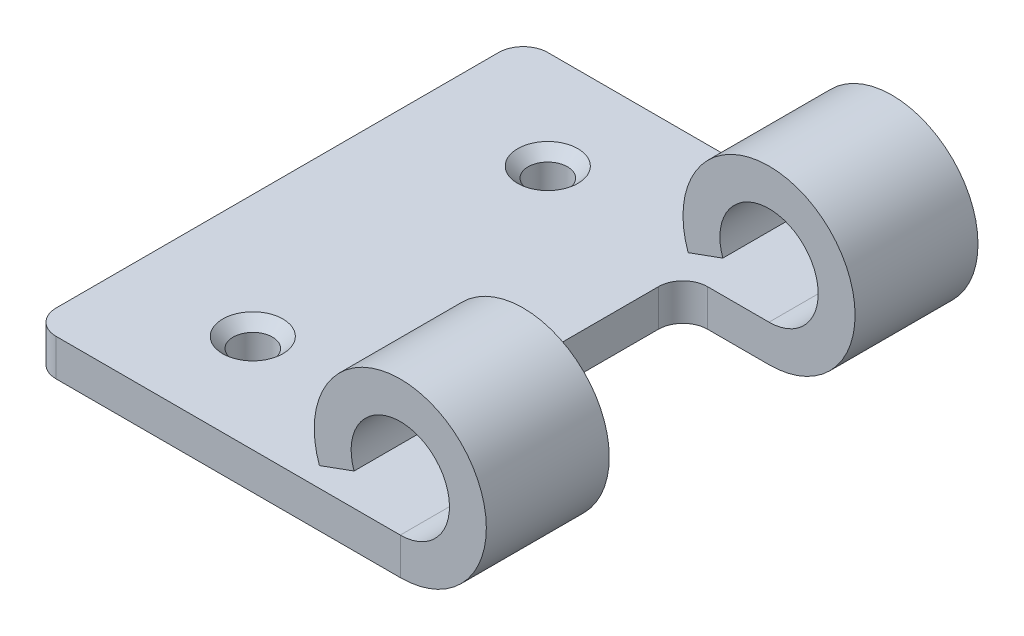
ISO-10303-21;
HEADER;
FILE_DESCRIPTION(('STEP AP214'),'2;1');
FILE_NAME('part.step','',(''),(''),'','','');
FILE_SCHEMA(('AUTOMOTIVE_DESIGN { 1 0 10303 214 1 1 1 1 }'));
ENDSEC;
DATA;
#1=APPLICATION_CONTEXT('core data for automotive mechanical design processes');
#2=APPLICATION_PROTOCOL_DEFINITION('international standard','automotive_design',2000,#1);
#3=PRODUCT_CONTEXT('',#1,'mechanical');
#4=PRODUCT('Part','Part','',(#3));
#5=PRODUCT_RELATED_PRODUCT_CATEGORY('part','',(#4));
#6=PRODUCT_DEFINITION_FORMATION('','',#4);
#7=PRODUCT_DEFINITION_CONTEXT('part definition',#1,'design');
#8=PRODUCT_DEFINITION('design','',#6,#7);
#9=PRODUCT_DEFINITION_SHAPE('','',#8);
#10=(LENGTH_UNIT() NAMED_UNIT(*) SI_UNIT(.MILLI.,.METRE.));
#11=(NAMED_UNIT(*) PLANE_ANGLE_UNIT() SI_UNIT($,.RADIAN.));
#12=(NAMED_UNIT(*) SI_UNIT($,.STERADIAN.) SOLID_ANGLE_UNIT());
#13=UNCERTAINTY_MEASURE_WITH_UNIT(LENGTH_MEASURE(1.E-05),#10,'distance_accuracy_value','');
#14=(GEOMETRIC_REPRESENTATION_CONTEXT(3) GLOBAL_UNCERTAINTY_ASSIGNED_CONTEXT((#13)) GLOBAL_UNIT_ASSIGNED_CONTEXT((#10,
#11,#12)) REPRESENTATION_CONTEXT('',''));
#15=CARTESIAN_POINT('',(0.,0.,0.));
#16=DIRECTION('',(0.,0.,1.));
#17=DIRECTION('',(1.,0.,0.));
#18=AXIS2_PLACEMENT_3D('',#15,#16,#17);
#19=CARTESIAN_POINT('',(18.5,-1.5,5.));
#20=DIRECTION('',(0.,0.,1.));
#21=DIRECTION('',(1.,0.,0.));
#22=AXIS2_PLACEMENT_3D('',#19,#20,#21);
#23=PLANE('',#22);
#24=DIRECTION('',(1.,0.,0.));
#25=VECTOR('',#24,1.);
#26=CARTESIAN_POINT('',(18.5,-1.5,5.));
#27=LINE('',#26,#25);
#28=CARTESIAN_POINT('',(12.5,-1.5,5.));
#29=VERTEX_POINT('',#28);
#30=CARTESIAN_POINT('',(15.,-1.5,5.));
#31=VERTEX_POINT('',#30);
#32=EDGE_CURVE('E325',#29,#31,#27,.T.);
#33=ORIENTED_EDGE('',*,*,#32,.F.);
#34=DIRECTION('',(0.,1.,0.));
#35=VECTOR('',#34,1.);
#36=CARTESIAN_POINT('',(12.5,0.,5.));
#37=LINE('',#36,#35);
#38=CARTESIAN_POINT('',(12.5,0.,5.));
#39=VERTEX_POINT('',#38);
#40=EDGE_CURVE('E275',#29,#39,#37,.T.);
#41=ORIENTED_EDGE('',*,*,#40,.T.);
#42=DIRECTION('',(1.,0.,0.));
#43=VECTOR('',#42,1.);
#44=CARTESIAN_POINT('',(0.,0.,5.));
#45=LINE('',#44,#43);
#46=CARTESIAN_POINT('',(15.,0.,5.));
#47=VERTEX_POINT('',#46);
#48=EDGE_CURVE('E352',#39,#47,#45,.T.);
#49=ORIENTED_EDGE('',*,*,#48,.T.);
#50=DIRECTION('',(0.,-1.,0.));
#51=VECTOR('',#50,1.);
#52=CARTESIAN_POINT('',(15.,0.,5.));
#53=LINE('',#52,#51);
#54=EDGE_CURVE('E216',#47,#31,#53,.T.);
#55=ORIENTED_EDGE('',*,*,#54,.T.);
#56=EDGE_LOOP('',(#33,#41,#49,#55));
#57=FACE_BOUND('',#56,.T.);
#58=ADVANCED_FACE('F54',(#57),#23,.F.);
#59=CARTESIAN_POINT('',(15.,2.,10.));
#60=DIRECTION('',(0.,0.,-1.));
#61=DIRECTION('',(-1.,0.,0.));
#62=AXIS2_PLACEMENT_3D('',#59,#60,#61);
#63=CYLINDRICAL_SURFACE('',#62,3.5);
#64=DIRECTION('',(0.,0.,-1.));
#65=VECTOR('',#64,1.);
#66=CARTESIAN_POINT('',(15.,-1.5,10.));
#67=LINE('',#66,#65);
#68=CARTESIAN_POINT('',(15.,-1.5,10.));
#69=VERTEX_POINT('',#68);
#70=EDGE_CURVE('E235',#69,#31,#67,.T.);
#71=ORIENTED_EDGE('',*,*,#70,.T.);
#72=CARTESIAN_POINT('',(15.,2.,5.));
#73=DIRECTION('',(0.,0.,1.));
#74=DIRECTION('',(1.,0.,0.));
#75=AXIS2_PLACEMENT_3D('',#72,#73,#74);
#76=CIRCLE('',#75,3.5);
#77=CARTESIAN_POINT('',(11.7110758272493,0.802929498360173,5.));
#78=VERTEX_POINT('',#77);
#79=EDGE_CURVE('E360',#31,#78,#76,.T.);
#80=ORIENTED_EDGE('',*,*,#79,.T.);
#81=DIRECTION('',(0.,0.,-1.));
#82=VECTOR('',#81,1.);
#83=CARTESIAN_POINT('',(11.7110758272493,0.802929498360173,10.));
#84=LINE('',#83,#82);
#85=CARTESIAN_POINT('',(11.7110758272493,0.802929498360173,10.));
#86=VERTEX_POINT('',#85);
#87=EDGE_CURVE('E265',#86,#78,#84,.T.);
#88=ORIENTED_EDGE('',*,*,#87,.F.);
#89=CARTESIAN_POINT('',(15.,2.,10.));
#90=DIRECTION('',(0.,0.,1.));
#91=DIRECTION('',(1.,0.,0.));
#92=AXIS2_PLACEMENT_3D('',#89,#90,#91);
#93=CIRCLE('',#92,3.5);
#94=EDGE_CURVE('E365',#69,#86,#93,.T.);
#95=ORIENTED_EDGE('',*,*,#94,.F.);
#96=EDGE_LOOP('',(#71,#80,#88,#95));
#97=FACE_BOUND('',#96,.T.);
#98=ADVANCED_FACE('F541',(#97),#63,.T.);
#99=CARTESIAN_POINT('',(13.1206147584282,1.31595971334867,10.));
#100=DIRECTION('',(0.342020143325665,-0.93969262078591,0.));
#101=DIRECTION('',(0.93969262078591,0.342020143325665,0.));
#102=AXIS2_PLACEMENT_3D('',#99,#100,#101);
#103=PLANE('',#102);
#104=DIRECTION('',(-0.93969262078591,-0.342020143325665,0.));
#105=VECTOR('',#104,1.);
#106=CARTESIAN_POINT('',(13.1206147584282,1.31595971334867,5.));
#107=LINE('',#106,#105);
#108=CARTESIAN_POINT('',(13.1206147584282,1.31595971334867,5.));
#109=VERTEX_POINT('',#108);
#110=EDGE_CURVE('E358',#109,#78,#107,.T.);
#111=ORIENTED_EDGE('',*,*,#110,.F.);
#112=DIRECTION('',(0.,0.,-1.));
#113=VECTOR('',#112,1.);
#114=CARTESIAN_POINT('',(13.1206147584282,1.31595971334867,10.));
#115=LINE('',#114,#113);
#116=CARTESIAN_POINT('',(13.1206147584282,1.31595971334867,10.));
#117=VERTEX_POINT('',#116);
#118=EDGE_CURVE('E261',#117,#109,#115,.T.);
#119=ORIENTED_EDGE('',*,*,#118,.F.);
#120=DIRECTION('',(-0.93969262078591,-0.342020143325665,0.));
#121=VECTOR('',#120,1.);
#122=CARTESIAN_POINT('',(13.1206147584282,1.31595971334867,10.));
#123=LINE('',#122,#121);
#124=EDGE_CURVE('E368',#117,#86,#123,.T.);
#125=ORIENTED_EDGE('',*,*,#124,.T.);
#126=ORIENTED_EDGE('',*,*,#87,.T.);
#127=EDGE_LOOP('',(#111,#119,#125,#126));
#128=FACE_BOUND('',#127,.T.);
#129=ADVANCED_FACE('F532',(#128),#103,.T.);
#130=CARTESIAN_POINT('',(15.,2.,10.));
#131=DIRECTION('',(0.,0.,-1.));
#132=DIRECTION('',(-1.,0.,0.));
#133=AXIS2_PLACEMENT_3D('',#130,#131,#132);
#134=CYLINDRICAL_SURFACE('',#133,2.);
#135=CARTESIAN_POINT('',(15.,2.,5.));
#136=DIRECTION('',(0.,0.,1.));
#137=DIRECTION('',(1.,0.,0.));
#138=AXIS2_PLACEMENT_3D('',#135,#136,#137);
#139=CIRCLE('',#138,2.);
#140=EDGE_CURVE('E355',#47,#109,#139,.T.);
#141=ORIENTED_EDGE('',*,*,#140,.F.);
#142=DIRECTION('',(0.,0.,-1.));
#143=VECTOR('',#142,1.);
#144=CARTESIAN_POINT('',(15.,0.,10.));
#145=LINE('',#144,#143);
#146=CARTESIAN_POINT('',(15.,0.,10.));
#147=VERTEX_POINT('',#146);
#148=EDGE_CURVE('E256',#147,#47,#145,.T.);
#149=ORIENTED_EDGE('',*,*,#148,.F.);
#150=CARTESIAN_POINT('',(15.,2.,10.));
#151=DIRECTION('',(0.,0.,1.));
#152=DIRECTION('',(1.,0.,0.));
#153=AXIS2_PLACEMENT_3D('',#150,#151,#152);
#154=CIRCLE('',#153,2.);
#155=EDGE_CURVE('E371',#147,#117,#154,.T.);
#156=ORIENTED_EDGE('',*,*,#155,.T.);
#157=ORIENTED_EDGE('',*,*,#118,.T.);
#158=EDGE_LOOP('',(#141,#149,#156,#157));
#159=FACE_BOUND('',#158,.T.);
#160=ADVANCED_FACE('F538',(#159),#134,.F.);
#161=CARTESIAN_POINT('',(15.,-1.5,10.));
#162=DIRECTION('',(0.,0.,1.));
#163=DIRECTION('',(1.,0.,0.));
#164=AXIS2_PLACEMENT_3D('',#161,#162,#163);
#165=PLANE('',#164);
#166=DIRECTION('',(0.,1.,0.));
#167=VECTOR('',#166,1.);
#168=CARTESIAN_POINT('',(15.,-1.5,10.));
#169=LINE('',#168,#167);
#170=EDGE_CURVE('E217',#69,#147,#169,.T.);
#171=ORIENTED_EDGE('',*,*,#170,.F.);
#172=ORIENTED_EDGE('',*,*,#94,.T.);
#173=ORIENTED_EDGE('',*,*,#124,.F.);
#174=ORIENTED_EDGE('',*,*,#155,.F.);
#175=EDGE_LOOP('',(#171,#172,#173,#174));
#176=FACE_BOUND('',#175,.T.);
#177=ADVANCED_FACE('F578',(#176),#165,.T.);
#178=CARTESIAN_POINT('',(15.,0.,-10.));
#179=DIRECTION('',(0.,0.,-1.));
#180=DIRECTION('',(-1.,0.,0.));
#181=AXIS2_PLACEMENT_3D('',#178,#179,#180);
#182=PLANE('',#181);
#183=DIRECTION('',(0.,-1.,0.));
#184=VECTOR('',#183,1.);
#185=CARTESIAN_POINT('',(15.,0.,-10.));
#186=LINE('',#185,#184);
#187=CARTESIAN_POINT('',(15.,0.,-10.));
#188=VERTEX_POINT('',#187);
#189=CARTESIAN_POINT('',(15.,-1.5,-10.));
#190=VERTEX_POINT('',#189);
#191=EDGE_CURVE('E269',#188,#190,#186,.T.);
#192=ORIENTED_EDGE('',*,*,#191,.F.);
#193=CARTESIAN_POINT('',(15.,2.,-10.));
#194=DIRECTION('',(0.,0.,1.));
#195=DIRECTION('',(1.,0.,0.));
#196=AXIS2_PLACEMENT_3D('',#193,#194,#195);
#197=CIRCLE('',#196,2.);
#198=CARTESIAN_POINT('',(13.1206147584282,1.31595971334867,-10.));
#199=VERTEX_POINT('',#198);
#200=EDGE_CURVE('E382',#188,#199,#197,.T.);
#201=ORIENTED_EDGE('',*,*,#200,.T.);
#202=DIRECTION('',(-0.93969262078591,-0.342020143325665,0.));
#203=VECTOR('',#202,1.);
#204=CARTESIAN_POINT('',(13.1206147584282,1.31595971334867,-10.));
#205=LINE('',#204,#203);
#206=CARTESIAN_POINT('',(11.7110758272493,0.802929498360173,-10.));
#207=VERTEX_POINT('',#206);
#208=EDGE_CURVE('E379',#199,#207,#205,.T.);
#209=ORIENTED_EDGE('',*,*,#208,.T.);
#210=CARTESIAN_POINT('',(15.,2.,-10.));
#211=DIRECTION('',(0.,0.,1.));
#212=DIRECTION('',(1.,0.,0.));
#213=AXIS2_PLACEMENT_3D('',#210,#211,#212);
#214=CIRCLE('',#213,3.5);
#215=EDGE_CURVE('E364',#190,#207,#214,.T.);
#216=ORIENTED_EDGE('',*,*,#215,.F.);
#217=EDGE_LOOP('',(#192,#201,#209,#216));
#218=FACE_BOUND('',#217,.T.);
#219=ADVANCED_FACE('F524',(#218),#182,.T.);
#220=CARTESIAN_POINT('',(11.7110758272493,0.802929498360173,-5.));
#221=VERTEX_POINT('',#220);
#222=EDGE_CURVE('E226',#221,#207,#84,.T.);
#223=ORIENTED_EDGE('',*,*,#222,.F.);
#224=CARTESIAN_POINT('',(15.,2.,-5.));
#225=DIRECTION('',(0.,0.,-1.));
#226=DIRECTION('',(-1.,0.,0.));
#227=AXIS2_PLACEMENT_3D('',#224,#225,#226);
#228=CIRCLE('',#227,3.5);
#229=CARTESIAN_POINT('',(15.,-1.5,-5.));
#230=VERTEX_POINT('',#229);
#231=EDGE_CURVE('E208',#221,#230,#228,.T.);
#232=ORIENTED_EDGE('',*,*,#231,.T.);
#233=EDGE_CURVE('E224',#230,#190,#67,.T.);
#234=ORIENTED_EDGE('',*,*,#233,.T.);
#235=ORIENTED_EDGE('',*,*,#215,.T.);
#236=EDGE_LOOP('',(#223,#232,#234,#235));
#237=FACE_BOUND('',#236,.T.);
#238=ADVANCED_FACE('F222',(#237),#63,.T.);
#239=DIRECTION('',(0.93969262078591,0.342020143325665,0.));
#240=VECTOR('',#239,1.);
#241=CARTESIAN_POINT('',(13.1206147584282,1.31595971334867,-5.));
#242=LINE('',#241,#240);
#243=CARTESIAN_POINT('',(13.1206147584282,1.31595971334867,-5.));
#244=VERTEX_POINT('',#243);
#245=EDGE_CURVE('E229',#221,#244,#242,.T.);
#246=ORIENTED_EDGE('',*,*,#245,.F.);
#247=ORIENTED_EDGE('',*,*,#222,.T.);
#248=ORIENTED_EDGE('',*,*,#208,.F.);
#249=EDGE_CURVE('E260',#244,#199,#115,.T.);
#250=ORIENTED_EDGE('',*,*,#249,.F.);
#251=EDGE_LOOP('',(#246,#247,#248,#250));
#252=FACE_BOUND('',#251,.T.);
#253=ADVANCED_FACE('F529',(#252),#103,.T.);
#254=CARTESIAN_POINT('',(15.,2.,-5.));
#255=DIRECTION('',(0.,0.,-1.));
#256=DIRECTION('',(-1.,0.,0.));
#257=AXIS2_PLACEMENT_3D('',#254,#255,#256);
#258=CIRCLE('',#257,2.);
#259=CARTESIAN_POINT('',(15.,0.,-5.));
#260=VERTEX_POINT('',#259);
#261=EDGE_CURVE('E323',#244,#260,#258,.T.);
#262=ORIENTED_EDGE('',*,*,#261,.F.);
#263=ORIENTED_EDGE('',*,*,#249,.T.);
#264=ORIENTED_EDGE('',*,*,#200,.F.);
#265=EDGE_CURVE('E255',#260,#188,#145,.T.);
#266=ORIENTED_EDGE('',*,*,#265,.F.);
#267=EDGE_LOOP('',(#262,#263,#264,#266));
#268=FACE_BOUND('',#267,.T.);
#269=ADVANCED_FACE('F525',(#268),#134,.F.);
#270=CARTESIAN_POINT('',(0.,0.,10.));
#271=DIRECTION('',(0.,1.,0.));
#272=DIRECTION('',(0.,0.,1.));
#273=AXIS2_PLACEMENT_3D('',#270,#271,#272);
#274=PLANE('',#273);
#275=CARTESIAN_POINT('',(5.,0.,-6.));
#276=DIRECTION('',(0.,1.,0.));
#277=DIRECTION('',(0.,0.,1.));
#278=AXIS2_PLACEMENT_3D('',#275,#276,#277);
#279=CIRCLE('',#278,1.225);
#280=CARTESIAN_POINT('',(5.,0.,-4.775));
#281=VERTEX_POINT('',#280);
#282=EDGE_CURVE('E489',#281,#281,#279,.T.);
#283=ORIENTED_EDGE('',*,*,#282,.F.);
#284=EDGE_LOOP('',(#283));
#285=FACE_BOUND('',#284,.T.);
#286=CARTESIAN_POINT('',(5.,0.,6.));
#287=DIRECTION('',(0.,1.,0.));
#288=DIRECTION('',(0.,0.,1.));
#289=AXIS2_PLACEMENT_3D('',#286,#287,#288);
#290=CIRCLE('',#289,1.225);
#291=CARTESIAN_POINT('',(5.,0.,7.225));
#292=VERTEX_POINT('',#291);
#293=EDGE_CURVE('E483',#292,#292,#290,.T.);
#294=ORIENTED_EDGE('',*,*,#293,.F.);
#295=EDGE_LOOP('',(#294));
#296=FACE_BOUND('',#295,.T.);
#297=DIRECTION('',(1.,0.,0.));
#298=VECTOR('',#297,1.);
#299=CARTESIAN_POINT('',(0.,0.,-10.));
#300=LINE('',#299,#298);
#301=CARTESIAN_POINT('',(1.,0.,-10.));
#302=VERTEX_POINT('',#301);
#303=EDGE_CURVE('E385',#302,#188,#300,.T.);
#304=ORIENTED_EDGE('',*,*,#303,.F.);
#305=CARTESIAN_POINT('',(1.,0.,-9.));
#306=DIRECTION('',(0.,1.,0.));
#307=DIRECTION('',(0.,0.,1.));
#308=AXIS2_PLACEMENT_3D('',#305,#306,#307);
#309=CIRCLE('',#308,1.);
#310=CARTESIAN_POINT('',(0.,0.,-9.));
#311=VERTEX_POINT('',#310);
#312=EDGE_CURVE('E290',#302,#311,#309,.T.);
#313=ORIENTED_EDGE('',*,*,#312,.T.);
#314=DIRECTION('',(0.,0.,-1.));
#315=VECTOR('',#314,1.);
#316=CARTESIAN_POINT('',(0.,0.,10.));
#317=LINE('',#316,#315);
#318=CARTESIAN_POINT('',(0.,0.,9.));
#319=VERTEX_POINT('',#318);
#320=EDGE_CURVE('E252',#319,#311,#317,.T.);
#321=ORIENTED_EDGE('',*,*,#320,.F.);
#322=CARTESIAN_POINT('',(1.,0.,9.));
#323=DIRECTION('',(0.,1.,0.));
#324=DIRECTION('',(0.,0.,1.));
#325=AXIS2_PLACEMENT_3D('',#322,#323,#324);
#326=CIRCLE('',#325,1.);
#327=CARTESIAN_POINT('',(1.,0.,10.));
#328=VERTEX_POINT('',#327);
#329=EDGE_CURVE('E287',#319,#328,#326,.T.);
#330=ORIENTED_EDGE('',*,*,#329,.T.);
#331=DIRECTION('',(1.,0.,0.));
#332=VECTOR('',#331,1.);
#333=CARTESIAN_POINT('',(0.,0.,10.));
#334=LINE('',#333,#332);
#335=EDGE_CURVE('E245',#328,#147,#334,.T.);
#336=ORIENTED_EDGE('',*,*,#335,.T.);
#337=ORIENTED_EDGE('',*,*,#148,.T.);
#338=ORIENTED_EDGE('',*,*,#48,.F.);
#339=CARTESIAN_POINT('',(12.5,0.,4.));
#340=DIRECTION('',(0.,1.,0.));
#341=DIRECTION('',(0.,0.,1.));
#342=AXIS2_PLACEMENT_3D('',#339,#340,#341);
#343=CIRCLE('',#342,1.);
#344=CARTESIAN_POINT('',(11.5,0.,4.));
#345=VERTEX_POINT('',#344);
#346=EDGE_CURVE('E304',#39,#345,#343,.F.);
#347=ORIENTED_EDGE('',*,*,#346,.T.);
#348=DIRECTION('',(0.,0.,1.));
#349=VECTOR('',#348,1.);
#350=CARTESIAN_POINT('',(11.5,0.,10.));
#351=LINE('',#350,#349);
#352=CARTESIAN_POINT('',(11.5,0.,-4.));
#353=VERTEX_POINT('',#352);
#354=EDGE_CURVE('E228',#353,#345,#351,.T.);
#355=ORIENTED_EDGE('',*,*,#354,.F.);
#356=CARTESIAN_POINT('',(12.5,0.,-4.));
#357=DIRECTION('',(0.,1.,0.));
#358=DIRECTION('',(0.,0.,1.));
#359=AXIS2_PLACEMENT_3D('',#356,#357,#358);
#360=CIRCLE('',#359,1.);
#361=CARTESIAN_POINT('',(12.5,0.,-5.));
#362=VERTEX_POINT('',#361);
#363=EDGE_CURVE('E63',#353,#362,#360,.F.);
#364=ORIENTED_EDGE('',*,*,#363,.T.);
#365=DIRECTION('',(-1.,0.,0.));
#366=VECTOR('',#365,1.);
#367=CARTESIAN_POINT('',(0.,0.,-5.));
#368=LINE('',#367,#366);
#369=EDGE_CURVE('E317',#260,#362,#368,.T.);
#370=ORIENTED_EDGE('',*,*,#369,.F.);
#371=ORIENTED_EDGE('',*,*,#265,.T.);
#372=EDGE_LOOP('',(#304,#313,#321,#330,#336,#337,#338,#347,#355,#364,#370,#371));
#373=FACE_BOUND('',#372,.T.);
#374=ADVANCED_FACE('F315',(#285,#296,#373),#274,.T.);
#375=CARTESIAN_POINT('',(0.,-1.5,10.));
#376=DIRECTION('',(-1.,0.,0.));
#377=DIRECTION('',(0.,0.,1.));
#378=AXIS2_PLACEMENT_3D('',#375,#376,#377);
#379=PLANE('',#378);
#380=ORIENTED_EDGE('',*,*,#320,.T.);
#381=DIRECTION('',(0.,1.,0.));
#382=VECTOR('',#381,1.);
#383=CARTESIAN_POINT('',(0.,-1.5,-9.));
#384=LINE('',#383,#382);
#385=CARTESIAN_POINT('',(0.,-1.5,-9.));
#386=VERTEX_POINT('',#385);
#387=EDGE_CURVE('E84',#311,#386,#384,.F.);
#388=ORIENTED_EDGE('',*,*,#387,.T.);
#389=DIRECTION('',(0.,0.,-1.));
#390=VECTOR('',#389,1.);
#391=CARTESIAN_POINT('',(0.,-1.5,10.));
#392=LINE('',#391,#390);
#393=CARTESIAN_POINT('',(0.,-1.5,9.));
#394=VERTEX_POINT('',#393);
#395=EDGE_CURVE('E243',#394,#386,#392,.T.);
#396=ORIENTED_EDGE('',*,*,#395,.F.);
#397=DIRECTION('',(0.,1.,0.));
#398=VECTOR('',#397,1.);
#399=CARTESIAN_POINT('',(0.,-1.5,9.));
#400=LINE('',#399,#398);
#401=EDGE_CURVE('E293',#394,#319,#400,.T.);
#402=ORIENTED_EDGE('',*,*,#401,.T.);
#403=EDGE_LOOP('',(#380,#388,#396,#402));
#404=FACE_BOUND('',#403,.T.);
#405=ADVANCED_FACE('F603',(#404),#379,.T.);
#406=CARTESIAN_POINT('',(0.,-1.5,10.));
#407=DIRECTION('',(0.,1.,0.));
#408=DIRECTION('',(0.,0.,1.));
#409=AXIS2_PLACEMENT_3D('',#406,#407,#408);
#410=PLANE('',#409);
#411=CARTESIAN_POINT('',(5.,-1.5,-6.));
#412=DIRECTION('',(0.,1.,0.));
#413=DIRECTION('',(0.,0.,1.));
#414=AXIS2_PLACEMENT_3D('',#411,#412,#413);
#415=CIRCLE('',#414,0.799999999999999);
#416=CARTESIAN_POINT('',(5.,-1.5,-5.2));
#417=VERTEX_POINT('',#416);
#418=EDGE_CURVE('E480',#417,#417,#415,.T.);
#419=ORIENTED_EDGE('',*,*,#418,.T.);
#420=EDGE_LOOP('',(#419));
#421=FACE_BOUND('',#420,.T.);
#422=CARTESIAN_POINT('',(5.,-1.5,6.));
#423=DIRECTION('',(0.,1.,0.));
#424=DIRECTION('',(0.,0.,1.));
#425=AXIS2_PLACEMENT_3D('',#422,#423,#424);
#426=CIRCLE('',#425,0.799999999999999);
#427=CARTESIAN_POINT('',(5.,-1.5,6.8));
#428=VERTEX_POINT('',#427);
#429=EDGE_CURVE('E336',#428,#428,#426,.T.);
#430=ORIENTED_EDGE('',*,*,#429,.T.);
#431=EDGE_LOOP('',(#430));
#432=FACE_BOUND('',#431,.T.);
#433=ORIENTED_EDGE('',*,*,#395,.T.);
#434=CARTESIAN_POINT('',(1.,-1.5,-9.));
#435=DIRECTION('',(0.,1.,0.));
#436=DIRECTION('',(0.,0.,1.));
#437=AXIS2_PLACEMENT_3D('',#434,#435,#436);
#438=CIRCLE('',#437,1.);
#439=CARTESIAN_POINT('',(1.,-1.5,-10.));
#440=VERTEX_POINT('',#439);
#441=EDGE_CURVE('E300',#386,#440,#438,.F.);
#442=ORIENTED_EDGE('',*,*,#441,.T.);
#443=DIRECTION('',(1.,0.,0.));
#444=VECTOR('',#443,1.);
#445=CARTESIAN_POINT('',(0.,-1.5,-10.));
#446=LINE('',#445,#444);
#447=EDGE_CURVE('E233',#440,#190,#446,.T.);
#448=ORIENTED_EDGE('',*,*,#447,.T.);
#449=ORIENTED_EDGE('',*,*,#233,.F.);
#450=DIRECTION('',(-1.,0.,0.));
#451=VECTOR('',#450,1.);
#452=CARTESIAN_POINT('',(0.,-1.5,-5.));
#453=LINE('',#452,#451);
#454=CARTESIAN_POINT('',(12.5,-1.5,-5.));
#455=VERTEX_POINT('',#454);
#456=EDGE_CURVE('E204',#230,#455,#453,.T.);
#457=ORIENTED_EDGE('',*,*,#456,.T.);
#458=CARTESIAN_POINT('',(12.5,-1.5,-4.));
#459=DIRECTION('',(0.,1.,0.));
#460=DIRECTION('',(0.,0.,1.));
#461=AXIS2_PLACEMENT_3D('',#458,#459,#460);
#462=CIRCLE('',#461,1.);
#463=CARTESIAN_POINT('',(11.5,-1.5,-4.));
#464=VERTEX_POINT('',#463);
#465=EDGE_CURVE('E12',#455,#464,#462,.T.);
#466=ORIENTED_EDGE('',*,*,#465,.T.);
#467=DIRECTION('',(0.,0.,1.));
#468=VECTOR('',#467,1.);
#469=CARTESIAN_POINT('',(11.5,-1.5,-5.));
#470=LINE('',#469,#468);
#471=CARTESIAN_POINT('',(11.5,-1.5,4.));
#472=VERTEX_POINT('',#471);
#473=EDGE_CURVE('E330',#464,#472,#470,.T.);
#474=ORIENTED_EDGE('',*,*,#473,.T.);
#475=CARTESIAN_POINT('',(12.5,-1.5,4.));
#476=DIRECTION('',(0.,1.,0.));
#477=DIRECTION('',(0.,0.,1.));
#478=AXIS2_PLACEMENT_3D('',#475,#476,#477);
#479=CIRCLE('',#478,1.);
#480=EDGE_CURVE('E307',#472,#29,#479,.T.);
#481=ORIENTED_EDGE('',*,*,#480,.T.);
#482=ORIENTED_EDGE('',*,*,#32,.T.);
#483=ORIENTED_EDGE('',*,*,#70,.F.);
#484=DIRECTION('',(1.,0.,0.));
#485=VECTOR('',#484,1.);
#486=CARTESIAN_POINT('',(0.,-1.5,10.));
#487=LINE('',#486,#485);
#488=CARTESIAN_POINT('',(1.,-1.5,10.));
#489=VERTEX_POINT('',#488);
#490=EDGE_CURVE('E236',#489,#69,#487,.T.);
#491=ORIENTED_EDGE('',*,*,#490,.F.);
#492=CARTESIAN_POINT('',(1.,-1.5,9.));
#493=DIRECTION('',(0.,1.,0.));
#494=DIRECTION('',(0.,0.,1.));
#495=AXIS2_PLACEMENT_3D('',#492,#493,#494);
#496=CIRCLE('',#495,1.);
#497=EDGE_CURVE('E297',#489,#394,#496,.F.);
#498=ORIENTED_EDGE('',*,*,#497,.T.);
#499=EDGE_LOOP('',(#433,#442,#448,#449,#457,#466,#474,#481,#482,#483,#491,#498));
#500=FACE_BOUND('',#499,.T.);
#501=ADVANCED_FACE('F231',(#421,#432,#500),#410,.F.);
#502=CARTESIAN_POINT('',(15.,2.,10.));
#503=DIRECTION('',(0.,0.,1.));
#504=DIRECTION('',(1.,0.,0.));
#505=AXIS2_PLACEMENT_3D('',#502,#503,#504);
#506=PLANE('',#505);
#507=ORIENTED_EDGE('',*,*,#335,.F.);
#508=DIRECTION('',(0.,1.,0.));
#509=VECTOR('',#508,1.);
#510=CARTESIAN_POINT('',(1.,2.,10.));
#511=LINE('',#510,#509);
#512=EDGE_CURVE('E74',#328,#489,#511,.F.);
#513=ORIENTED_EDGE('',*,*,#512,.T.);
#514=ORIENTED_EDGE('',*,*,#490,.T.);
#515=ORIENTED_EDGE('',*,*,#170,.T.);
#516=EDGE_LOOP('',(#507,#513,#514,#515));
#517=FACE_BOUND('',#516,.T.);
#518=ADVANCED_FACE('F564',(#517),#506,.T.);
#519=CARTESIAN_POINT('',(15.,2.,-10.));
#520=DIRECTION('',(0.,0.,1.));
#521=DIRECTION('',(1.,0.,0.));
#522=AXIS2_PLACEMENT_3D('',#519,#520,#521);
#523=PLANE('',#522);
#524=ORIENTED_EDGE('',*,*,#447,.F.);
#525=DIRECTION('',(0.,1.,0.));
#526=VECTOR('',#525,1.);
#527=CARTESIAN_POINT('',(1.,0.,-10.));
#528=LINE('',#527,#526);
#529=EDGE_CURVE('E284',#440,#302,#528,.T.);
#530=ORIENTED_EDGE('',*,*,#529,.T.);
#531=ORIENTED_EDGE('',*,*,#303,.T.);
#532=ORIENTED_EDGE('',*,*,#191,.T.);
#533=EDGE_LOOP('',(#524,#530,#531,#532));
#534=FACE_BOUND('',#533,.T.);
#535=ADVANCED_FACE('F557',(#534),#523,.F.);
#536=ORIENTED_EDGE('',*,*,#54,.F.);
#537=ORIENTED_EDGE('',*,*,#140,.T.);
#538=ORIENTED_EDGE('',*,*,#110,.T.);
#539=ORIENTED_EDGE('',*,*,#79,.F.);
#540=EDGE_LOOP('',(#536,#537,#538,#539));
#541=FACE_BOUND('',#540,.T.);
#542=ADVANCED_FACE('F547',(#541),#23,.F.);
#543=CARTESIAN_POINT('',(18.5,-1.5,-5.));
#544=DIRECTION('',(0.,0.,-1.));
#545=DIRECTION('',(-1.,0.,0.));
#546=AXIS2_PLACEMENT_3D('',#543,#544,#545);
#547=PLANE('',#546);
#548=ORIENTED_EDGE('',*,*,#369,.T.);
#549=DIRECTION('',(0.,1.,0.));
#550=VECTOR('',#549,1.);
#551=CARTESIAN_POINT('',(12.5,-1.5,-5.));
#552=LINE('',#551,#550);
#553=EDGE_CURVE('E211',#362,#455,#552,.F.);
#554=ORIENTED_EDGE('',*,*,#553,.T.);
#555=ORIENTED_EDGE('',*,*,#456,.F.);
#556=ORIENTED_EDGE('',*,*,#231,.F.);
#557=ORIENTED_EDGE('',*,*,#245,.T.);
#558=ORIENTED_EDGE('',*,*,#261,.T.);
#559=EDGE_LOOP('',(#548,#554,#555,#556,#557,#558));
#560=FACE_BOUND('',#559,.T.);
#561=ADVANCED_FACE('F207',(#560),#547,.F.);
#562=CARTESIAN_POINT('',(11.5,-1.5,-5.));
#563=DIRECTION('',(-1.,0.,0.));
#564=DIRECTION('',(0.,0.,1.));
#565=AXIS2_PLACEMENT_3D('',#562,#563,#564);
#566=PLANE('',#565);
#567=ORIENTED_EDGE('',*,*,#354,.T.);
#568=DIRECTION('',(0.,1.,0.));
#569=VECTOR('',#568,1.);
#570=CARTESIAN_POINT('',(11.5,-1.5,4.));
#571=LINE('',#570,#569);
#572=EDGE_CURVE('E281',#345,#472,#571,.F.);
#573=ORIENTED_EDGE('',*,*,#572,.T.);
#574=ORIENTED_EDGE('',*,*,#473,.F.);
#575=DIRECTION('',(0.,1.,0.));
#576=VECTOR('',#575,1.);
#577=CARTESIAN_POINT('',(11.5,0.,-4.));
#578=LINE('',#577,#576);
#579=EDGE_CURVE('E278',#464,#353,#578,.T.);
#580=ORIENTED_EDGE('',*,*,#579,.T.);
#581=EDGE_LOOP('',(#567,#573,#574,#580));
#582=FACE_BOUND('',#581,.T.);
#583=ADVANCED_FACE('F333',(#582),#566,.F.);
#584=CARTESIAN_POINT('',(12.5,-1.5,4.));
#585=DIRECTION('',(0.,-1.,0.));
#586=DIRECTION('',(0.,0.,-1.));
#587=AXIS2_PLACEMENT_3D('',#584,#585,#586);
#588=CYLINDRICAL_SURFACE('',#587,1.);
#589=ORIENTED_EDGE('',*,*,#480,.F.);
#590=ORIENTED_EDGE('',*,*,#572,.F.);
#591=ORIENTED_EDGE('',*,*,#346,.F.);
#592=ORIENTED_EDGE('',*,*,#40,.F.);
#593=EDGE_LOOP('',(#589,#590,#591,#592));
#594=FACE_BOUND('',#593,.T.);
#595=ADVANCED_FACE('F585',(#594),#588,.F.);
#596=CARTESIAN_POINT('',(12.5,-1.5,-4.));
#597=DIRECTION('',(0.,-1.,0.));
#598=DIRECTION('',(0.,0.,-1.));
#599=AXIS2_PLACEMENT_3D('',#596,#597,#598);
#600=CYLINDRICAL_SURFACE('',#599,1.);
#601=ORIENTED_EDGE('',*,*,#465,.F.);
#602=ORIENTED_EDGE('',*,*,#553,.F.);
#603=ORIENTED_EDGE('',*,*,#363,.F.);
#604=ORIENTED_EDGE('',*,*,#579,.F.);
#605=EDGE_LOOP('',(#601,#602,#603,#604));
#606=FACE_BOUND('',#605,.T.);
#607=ADVANCED_FACE('F327',(#606),#600,.F.);
#608=CARTESIAN_POINT('',(1.,2.,-9.));
#609=DIRECTION('',(0.,-1.,0.));
#610=DIRECTION('',(0.,0.,-1.));
#611=AXIS2_PLACEMENT_3D('',#608,#609,#610);
#612=CYLINDRICAL_SURFACE('',#611,1.);
#613=ORIENTED_EDGE('',*,*,#441,.F.);
#614=ORIENTED_EDGE('',*,*,#387,.F.);
#615=ORIENTED_EDGE('',*,*,#312,.F.);
#616=ORIENTED_EDGE('',*,*,#529,.F.);
#617=EDGE_LOOP('',(#613,#614,#615,#616));
#618=FACE_BOUND('',#617,.T.);
#619=ADVANCED_FACE('F589',(#618),#612,.T.);
#620=CARTESIAN_POINT('',(1.,-1.5,9.));
#621=DIRECTION('',(0.,1.,0.));
#622=DIRECTION('',(0.,0.,1.));
#623=AXIS2_PLACEMENT_3D('',#620,#621,#622);
#624=CYLINDRICAL_SURFACE('',#623,1.);
#625=ORIENTED_EDGE('',*,*,#497,.F.);
#626=ORIENTED_EDGE('',*,*,#512,.F.);
#627=ORIENTED_EDGE('',*,*,#329,.F.);
#628=ORIENTED_EDGE('',*,*,#401,.F.);
#629=EDGE_LOOP('',(#625,#626,#627,#628));
#630=FACE_BOUND('',#629,.T.);
#631=ADVANCED_FACE('F56',(#630),#624,.T.);
#632=CARTESIAN_POINT('',(5.,0.,6.));
#633=DIRECTION('',(0.,1.,0.));
#634=DIRECTION('',(0.,0.,1.));
#635=AXIS2_PLACEMENT_3D('',#632,#633,#634);
#636=CYLINDRICAL_SURFACE('',#635,0.799999999999999);
#637=ORIENTED_EDGE('',*,*,#429,.F.);
#638=EDGE_LOOP('',(#637));
#639=FACE_BOUND('',#638,.T.);
#640=CARTESIAN_POINT('',(5.,-0.425,6.));
#641=DIRECTION('',(0.,1.,0.));
#642=DIRECTION('',(0.,0.,1.));
#643=AXIS2_PLACEMENT_3D('',#640,#641,#642);
#644=CIRCLE('',#643,0.799999999999999);
#645=CARTESIAN_POINT('',(5.,-0.425,6.8));
#646=VERTEX_POINT('',#645);
#647=EDGE_CURVE('E344',#646,#646,#644,.T.);
#648=ORIENTED_EDGE('',*,*,#647,.T.);
#649=EDGE_LOOP('',(#648));
#650=FACE_BOUND('',#649,.T.);
#651=ADVANCED_FACE('F598',(#639,#650),#636,.F.);
#652=CARTESIAN_POINT('',(5.,0.,6.));
#653=DIRECTION('',(0.,1.,0.));
#654=DIRECTION('',(0.,0.,1.));
#655=AXIS2_PLACEMENT_3D('',#652,#653,#654);
#656=CONICAL_SURFACE('',#655,1.225,0.785398163397447);
#657=ORIENTED_EDGE('',*,*,#647,.F.);
#658=EDGE_LOOP('',(#657));
#659=FACE_BOUND('',#658,.T.);
#660=ORIENTED_EDGE('',*,*,#293,.T.);
#661=EDGE_LOOP('',(#660));
#662=FACE_BOUND('',#661,.T.);
#663=ADVANCED_FACE('F632',(#659,#662),#656,.F.);
#664=CARTESIAN_POINT('',(5.,0.,-6.));
#665=DIRECTION('',(0.,1.,0.));
#666=DIRECTION('',(0.,0.,1.));
#667=AXIS2_PLACEMENT_3D('',#664,#665,#666);
#668=CYLINDRICAL_SURFACE('',#667,0.799999999999999);
#669=ORIENTED_EDGE('',*,*,#418,.F.);
#670=EDGE_LOOP('',(#669));
#671=FACE_BOUND('',#670,.T.);
#672=CARTESIAN_POINT('',(5.,-0.425,-6.));
#673=DIRECTION('',(0.,1.,0.));
#674=DIRECTION('',(0.,0.,1.));
#675=AXIS2_PLACEMENT_3D('',#672,#673,#674);
#676=CIRCLE('',#675,0.799999999999999);
#677=CARTESIAN_POINT('',(5.,-0.425,-5.2));
#678=VERTEX_POINT('',#677);
#679=EDGE_CURVE('E484',#678,#678,#676,.T.);
#680=ORIENTED_EDGE('',*,*,#679,.T.);
#681=EDGE_LOOP('',(#680));
#682=FACE_BOUND('',#681,.T.);
#683=ADVANCED_FACE('F636',(#671,#682),#668,.F.);
#684=CARTESIAN_POINT('',(5.,0.,-6.));
#685=DIRECTION('',(0.,1.,0.));
#686=DIRECTION('',(0.,0.,1.));
#687=AXIS2_PLACEMENT_3D('',#684,#685,#686);
#688=CONICAL_SURFACE('',#687,1.225,0.785398163397447);
#689=ORIENTED_EDGE('',*,*,#679,.F.);
#690=EDGE_LOOP('',(#689));
#691=FACE_BOUND('',#690,.T.);
#692=ORIENTED_EDGE('',*,*,#282,.T.);
#693=EDGE_LOOP('',(#692));
#694=FACE_BOUND('',#693,.T.);
#695=ADVANCED_FACE('F637',(#691,#694),#688,.F.);
#696=CLOSED_SHELL('',(#58,#98,#129,#160,#177,#219,#238,#253,#269,#374,#405,#501,#518,#535,#542,
#561,#583,#595,#607,#619,#631,#651,#663,#683,#695));
#697=MANIFOLD_SOLID_BREP('B2',#696);
#698=ADVANCED_BREP_SHAPE_REPRESENTATION('',(#18,#697),#14);
#699=SHAPE_DEFINITION_REPRESENTATION(#9,#698);
ENDSEC;
END-ISO-10303-21;
